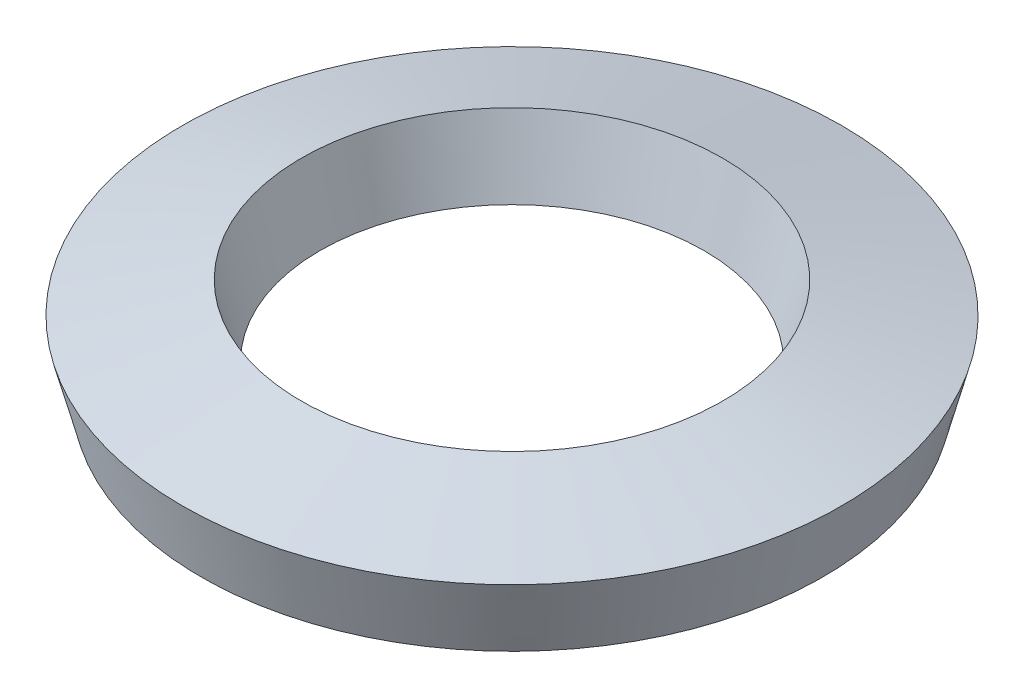
ISO-10303-21;
HEADER;
FILE_DESCRIPTION(('STEP AP214'),'2;1');
FILE_NAME('part.step','',(''),(''),'','','');
FILE_SCHEMA(('AUTOMOTIVE_DESIGN { 1 0 10303 214 1 1 1 1 }'));
ENDSEC;
DATA;
#1=APPLICATION_CONTEXT('core data for automotive mechanical design processes');
#2=APPLICATION_PROTOCOL_DEFINITION('international standard','automotive_design',2000,#1);
#3=PRODUCT_CONTEXT('',#1,'mechanical');
#4=PRODUCT('Part','Part','',(#3));
#5=PRODUCT_RELATED_PRODUCT_CATEGORY('part','',(#4));
#6=PRODUCT_DEFINITION_FORMATION('','',#4);
#7=PRODUCT_DEFINITION_CONTEXT('part definition',#1,'design');
#8=PRODUCT_DEFINITION('design','',#6,#7);
#9=PRODUCT_DEFINITION_SHAPE('','',#8);
#10=(LENGTH_UNIT() NAMED_UNIT(*) SI_UNIT(.MILLI.,.METRE.));
#11=(NAMED_UNIT(*) PLANE_ANGLE_UNIT() SI_UNIT($,.RADIAN.));
#12=(NAMED_UNIT(*) SI_UNIT($,.STERADIAN.) SOLID_ANGLE_UNIT());
#13=UNCERTAINTY_MEASURE_WITH_UNIT(LENGTH_MEASURE(1.E-05),#10,'distance_accuracy_value','');
#14=(GEOMETRIC_REPRESENTATION_CONTEXT(3) GLOBAL_UNCERTAINTY_ASSIGNED_CONTEXT((#13)) GLOBAL_UNIT_ASSIGNED_CONTEXT((#10,
#11,#12)) REPRESENTATION_CONTEXT('',''));
#15=CARTESIAN_POINT('',(0.,0.,0.));
#16=DIRECTION('',(0.,0.,1.));
#17=DIRECTION('',(1.,0.,0.));
#18=AXIS2_PLACEMENT_3D('',#15,#16,#17);
#19=CARTESIAN_POINT('',(0.,0.,0.));
#20=DIRECTION('',(0.,1.,0.));
#21=DIRECTION('',(0.,0.,1.));
#22=AXIS2_PLACEMENT_3D('',#19,#20,#21);
#23=CONICAL_SURFACE('',#22,3.55896722699708,0.256850626261418);
#24=CARTESIAN_POINT('',(0.,0.81070270394349,0.));
#25=DIRECTION('',(0.,-1.,0.));
#26=DIRECTION('',(0.,0.,-1.));
#27=AXIS2_PLACEMENT_3D('',#24,#25,#26);
#28=CIRCLE('',#27,3.7719);
#29=CARTESIAN_POINT('',(0.,0.81070270394349,-3.7719));
#30=VERTEX_POINT('',#29);
#31=EDGE_CURVE('E43',#30,#30,#28,.T.);
#32=ORIENTED_EDGE('',*,*,#31,.T.);
#33=EDGE_LOOP('',(#32));
#34=FACE_BOUND('',#33,.T.);
#35=CARTESIAN_POINT('',(0.,0.,0.));
#36=DIRECTION('',(0.,-1.,0.));
#37=DIRECTION('',(0.,0.,-1.));
#38=AXIS2_PLACEMENT_3D('',#35,#36,#37);
#39=CIRCLE('',#38,3.55896722699708);
#40=CARTESIAN_POINT('',(0.,0.,-3.55896722699708));
#41=VERTEX_POINT('',#40);
#42=EDGE_CURVE('E10',#41,#41,#39,.T.);
#43=ORIENTED_EDGE('',*,*,#42,.F.);
#44=EDGE_LOOP('',(#43));
#45=FACE_BOUND('',#44,.T.);
#46=ADVANCED_FACE('F29',(#34,#45),#23,.T.);
#47=CARTESIAN_POINT('',(0.,0.35769729605651,0.));
#48=DIRECTION('',(0.,-1.,0.));
#49=DIRECTION('',(0.,0.,-1.));
#50=AXIS2_PLACEMENT_3D('',#47,#48,#49);
#51=CONICAL_SURFACE('',#50,2.1971,1.31394570053348);
#52=ORIENTED_EDGE('',*,*,#42,.T.);
#53=EDGE_LOOP('',(#52));
#54=FACE_BOUND('',#53,.T.);
#55=CARTESIAN_POINT('',(0.,0.35769729605651,0.));
#56=DIRECTION('',(0.,-1.,0.));
#57=DIRECTION('',(0.,0.,-1.));
#58=AXIS2_PLACEMENT_3D('',#55,#56,#57);
#59=CIRCLE('',#58,2.1971);
#60=CARTESIAN_POINT('',(0.,0.35769729605651,-2.1971));
#61=VERTEX_POINT('',#60);
#62=EDGE_CURVE('E35',#61,#61,#59,.T.);
#63=ORIENTED_EDGE('',*,*,#62,.F.);
#64=EDGE_LOOP('',(#63));
#65=FACE_BOUND('',#64,.T.);
#66=ADVANCED_FACE('F59',(#54,#65),#51,.F.);
#67=CARTESIAN_POINT('',(0.,1.1684,0.));
#68=DIRECTION('',(0.,1.,0.));
#69=DIRECTION('',(0.,0.,1.));
#70=AXIS2_PLACEMENT_3D('',#67,#68,#69);
#71=CONICAL_SURFACE('',#70,2.41003277300292,0.256850626261418);
#72=ORIENTED_EDGE('',*,*,#62,.T.);
#73=EDGE_LOOP('',(#72));
#74=FACE_BOUND('',#73,.T.);
#75=CARTESIAN_POINT('',(0.,1.1684,0.));
#76=DIRECTION('',(0.,-1.,0.));
#77=DIRECTION('',(0.,0.,-1.));
#78=AXIS2_PLACEMENT_3D('',#75,#76,#77);
#79=CIRCLE('',#78,2.41003277300292);
#80=CARTESIAN_POINT('',(0.,1.1684,-2.41003277300292));
#81=VERTEX_POINT('',#80);
#82=EDGE_CURVE('E39',#81,#81,#79,.T.);
#83=ORIENTED_EDGE('',*,*,#82,.F.);
#84=EDGE_LOOP('',(#83));
#85=FACE_BOUND('',#84,.T.);
#86=ADVANCED_FACE('F53',(#74,#85),#71,.F.);
#87=CARTESIAN_POINT('',(0.,0.81070270394349,0.));
#88=DIRECTION('',(0.,-1.,0.));
#89=DIRECTION('',(0.,0.,-1.));
#90=AXIS2_PLACEMENT_3D('',#87,#88,#89);
#91=CONICAL_SURFACE('',#90,3.7719,1.31394570053348);
#92=ORIENTED_EDGE('',*,*,#82,.T.);
#93=EDGE_LOOP('',(#92));
#94=FACE_BOUND('',#93,.T.);
#95=ORIENTED_EDGE('',*,*,#31,.F.);
#96=EDGE_LOOP('',(#95));
#97=FACE_BOUND('',#96,.T.);
#98=ADVANCED_FACE('F51',(#94,#97),#91,.T.);
#99=CLOSED_SHELL('',(#46,#66,#86,#98));
#100=MANIFOLD_SOLID_BREP('B2',#99);
#101=ADVANCED_BREP_SHAPE_REPRESENTATION('',(#18,#100),#14);
#102=SHAPE_DEFINITION_REPRESENTATION(#9,#101);
ENDSEC;
END-ISO-10303-21;
